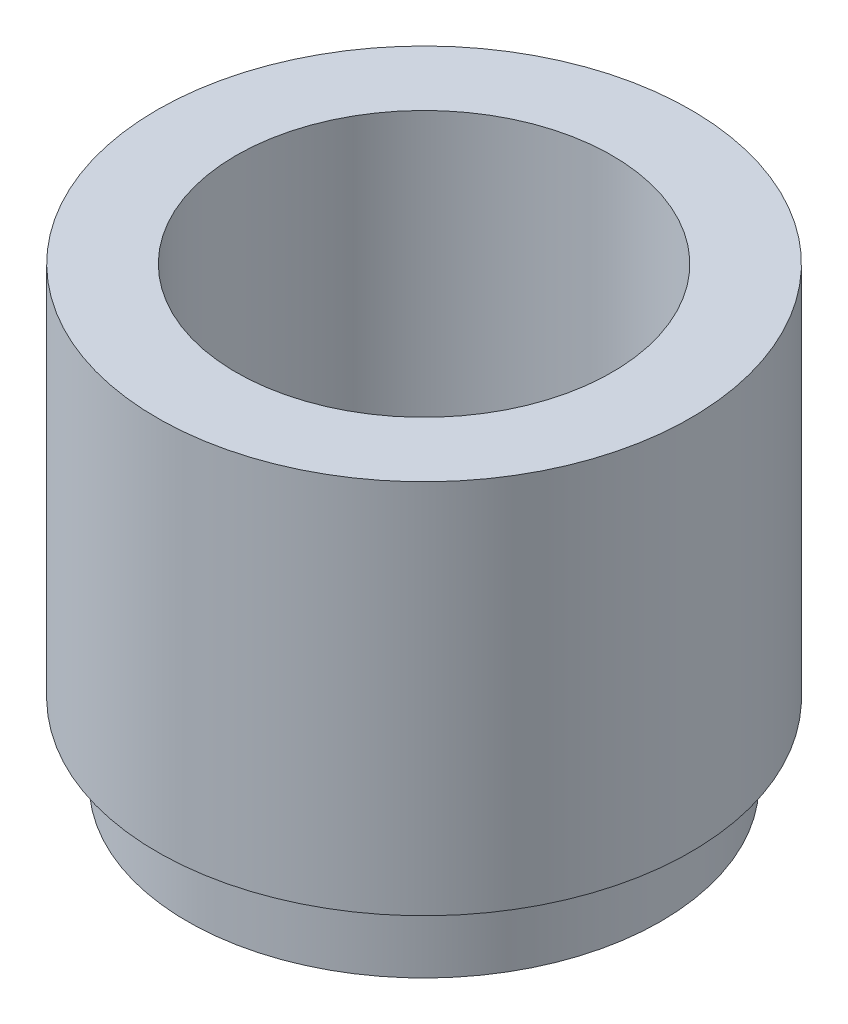
ISO-10303-21;
HEADER;
FILE_DESCRIPTION(('STEP AP214'),'2;1');
FILE_NAME('part.step','',(''),(''),'','','');
FILE_SCHEMA(('AUTOMOTIVE_DESIGN { 1 0 10303 214 1 1 1 1 }'));
ENDSEC;
DATA;
#1=APPLICATION_CONTEXT('core data for automotive mechanical design processes');
#2=APPLICATION_PROTOCOL_DEFINITION('international standard','automotive_design',2000,#1);
#3=PRODUCT_CONTEXT('',#1,'mechanical');
#4=PRODUCT('Part','Part','',(#3));
#5=PRODUCT_RELATED_PRODUCT_CATEGORY('part','',(#4));
#6=PRODUCT_DEFINITION_FORMATION('','',#4);
#7=PRODUCT_DEFINITION_CONTEXT('part definition',#1,'design');
#8=PRODUCT_DEFINITION('design','',#6,#7);
#9=PRODUCT_DEFINITION_SHAPE('','',#8);
#10=(LENGTH_UNIT() NAMED_UNIT(*) SI_UNIT(.MILLI.,.METRE.));
#11=(NAMED_UNIT(*) PLANE_ANGLE_UNIT() SI_UNIT($,.RADIAN.));
#12=(NAMED_UNIT(*) SI_UNIT($,.STERADIAN.) SOLID_ANGLE_UNIT());
#13=UNCERTAINTY_MEASURE_WITH_UNIT(LENGTH_MEASURE(1.E-05),#10,'distance_accuracy_value','');
#14=(GEOMETRIC_REPRESENTATION_CONTEXT(3) GLOBAL_UNCERTAINTY_ASSIGNED_CONTEXT((#13)) GLOBAL_UNIT_ASSIGNED_CONTEXT((#10,
#11,#12)) REPRESENTATION_CONTEXT('',''));
#15=CARTESIAN_POINT('',(0.,0.,0.));
#16=DIRECTION('',(0.,0.,1.));
#17=DIRECTION('',(1.,0.,0.));
#18=AXIS2_PLACEMENT_3D('',#15,#16,#17);
#19=CARTESIAN_POINT('',(0.,6.,0.));
#20=DIRECTION('',(0.,1.,0.));
#21=DIRECTION('',(-1.,0.,0.));
#22=AXIS2_PLACEMENT_3D('',#19,#20,#21);
#23=CYLINDRICAL_SURFACE('',#22,3.15);
#24=CARTESIAN_POINT('',(0.,1.,0.));
#25=DIRECTION('',(0.,1.,0.));
#26=DIRECTION('',(-1.,0.,0.));
#27=AXIS2_PLACEMENT_3D('',#24,#25,#26);
#28=CIRCLE('',#27,3.15);
#29=CARTESIAN_POINT('',(-3.15,1.,0.));
#30=VERTEX_POINT('',#29);
#31=EDGE_CURVE('E57',#30,#30,#28,.T.);
#32=ORIENTED_EDGE('',*,*,#31,.F.);
#33=EDGE_LOOP('',(#32));
#34=FACE_BOUND('',#33,.T.);
#35=CARTESIAN_POINT('',(0.,0.,0.));
#36=DIRECTION('',(0.,1.,0.));
#37=DIRECTION('',(-1.,0.,0.));
#38=AXIS2_PLACEMENT_3D('',#35,#36,#37);
#39=CIRCLE('',#38,3.15);
#40=CARTESIAN_POINT('',(-3.15,0.,0.));
#41=VERTEX_POINT('',#40);
#42=EDGE_CURVE('E10',#41,#41,#39,.T.);
#43=ORIENTED_EDGE('',*,*,#42,.T.);
#44=EDGE_LOOP('',(#43));
#45=FACE_BOUND('',#44,.T.);
#46=ADVANCED_FACE('F35',(#34,#45),#23,.T.);
#47=CARTESIAN_POINT('',(2.5,0.,0.));
#48=DIRECTION('',(0.,1.,0.));
#49=DIRECTION('',(-1.,0.,0.));
#50=AXIS2_PLACEMENT_3D('',#47,#48,#49);
#51=PLANE('',#50);
#52=ORIENTED_EDGE('',*,*,#42,.F.);
#53=EDGE_LOOP('',(#52));
#54=FACE_BOUND('',#53,.T.);
#55=CARTESIAN_POINT('',(0.,0.,0.));
#56=DIRECTION('',(0.,1.,0.));
#57=DIRECTION('',(-1.,0.,0.));
#58=AXIS2_PLACEMENT_3D('',#55,#56,#57);
#59=CIRCLE('',#58,2.5);
#60=CARTESIAN_POINT('',(-2.5,0.,0.));
#61=VERTEX_POINT('',#60);
#62=EDGE_CURVE('E41',#61,#61,#59,.T.);
#63=ORIENTED_EDGE('',*,*,#62,.T.);
#64=EDGE_LOOP('',(#63));
#65=FACE_BOUND('',#64,.T.);
#66=ADVANCED_FACE('F64',(#54,#65),#51,.F.);
#67=CARTESIAN_POINT('',(0.,6.,0.));
#68=DIRECTION('',(0.,1.,0.));
#69=DIRECTION('',(-1.,0.,0.));
#70=AXIS2_PLACEMENT_3D('',#67,#68,#69);
#71=CYLINDRICAL_SURFACE('',#70,2.5);
#72=ORIENTED_EDGE('',*,*,#62,.F.);
#73=EDGE_LOOP('',(#72));
#74=FACE_BOUND('',#73,.T.);
#75=CARTESIAN_POINT('',(0.,6.,0.));
#76=DIRECTION('',(0.,1.,0.));
#77=DIRECTION('',(-1.,0.,0.));
#78=AXIS2_PLACEMENT_3D('',#75,#76,#77);
#79=CIRCLE('',#78,2.5);
#80=CARTESIAN_POINT('',(-2.5,6.,0.));
#81=VERTEX_POINT('',#80);
#82=EDGE_CURVE('E45',#81,#81,#79,.T.);
#83=ORIENTED_EDGE('',*,*,#82,.T.);
#84=EDGE_LOOP('',(#83));
#85=FACE_BOUND('',#84,.T.);
#86=ADVANCED_FACE('F68',(#74,#85),#71,.F.);
#87=CARTESIAN_POINT('',(3.55,6.,0.));
#88=DIRECTION('',(0.,-1.,0.));
#89=DIRECTION('',(1.,0.,0.));
#90=AXIS2_PLACEMENT_3D('',#87,#88,#89);
#91=PLANE('',#90);
#92=ORIENTED_EDGE('',*,*,#82,.F.);
#93=EDGE_LOOP('',(#92));
#94=FACE_BOUND('',#93,.T.);
#95=CARTESIAN_POINT('',(0.,6.,0.));
#96=DIRECTION('',(0.,1.,0.));
#97=DIRECTION('',(-1.,0.,0.));
#98=AXIS2_PLACEMENT_3D('',#95,#96,#97);
#99=CIRCLE('',#98,3.55);
#100=CARTESIAN_POINT('',(-3.55,6.,0.));
#101=VERTEX_POINT('',#100);
#102=EDGE_CURVE('E49',#101,#101,#99,.T.);
#103=ORIENTED_EDGE('',*,*,#102,.T.);
#104=EDGE_LOOP('',(#103));
#105=FACE_BOUND('',#104,.T.);
#106=ADVANCED_FACE('F73',(#94,#105),#91,.F.);
#107=CARTESIAN_POINT('',(0.,6.,0.));
#108=DIRECTION('',(0.,1.,0.));
#109=DIRECTION('',(-1.,0.,0.));
#110=AXIS2_PLACEMENT_3D('',#107,#108,#109);
#111=CYLINDRICAL_SURFACE('',#110,3.55);
#112=ORIENTED_EDGE('',*,*,#102,.F.);
#113=EDGE_LOOP('',(#112));
#114=FACE_BOUND('',#113,.T.);
#115=CARTESIAN_POINT('',(0.,1.,0.));
#116=DIRECTION('',(0.,1.,0.));
#117=DIRECTION('',(-1.,0.,0.));
#118=AXIS2_PLACEMENT_3D('',#115,#116,#117);
#119=CIRCLE('',#118,3.55);
#120=CARTESIAN_POINT('',(-3.55,1.,0.));
#121=VERTEX_POINT('',#120);
#122=EDGE_CURVE('E54',#121,#121,#119,.T.);
#123=ORIENTED_EDGE('',*,*,#122,.T.);
#124=EDGE_LOOP('',(#123));
#125=FACE_BOUND('',#124,.T.);
#126=ADVANCED_FACE('F79',(#114,#125),#111,.T.);
#127=CARTESIAN_POINT('',(3.15,1.,0.));
#128=DIRECTION('',(0.,1.,0.));
#129=DIRECTION('',(-1.,0.,0.));
#130=AXIS2_PLACEMENT_3D('',#127,#128,#129);
#131=PLANE('',#130);
#132=ORIENTED_EDGE('',*,*,#122,.F.);
#133=EDGE_LOOP('',(#132));
#134=FACE_BOUND('',#133,.T.);
#135=ORIENTED_EDGE('',*,*,#31,.T.);
#136=EDGE_LOOP('',(#135));
#137=FACE_BOUND('',#136,.T.);
#138=ADVANCED_FACE('F61',(#134,#137),#131,.F.);
#139=CLOSED_SHELL('',(#46,#66,#86,#106,#126,#138));
#140=MANIFOLD_SOLID_BREP('B2',#139);
#141=ADVANCED_BREP_SHAPE_REPRESENTATION('',(#18,#140),#14);
#142=SHAPE_DEFINITION_REPRESENTATION(#9,#141);
ENDSEC;
END-ISO-10303-21;
